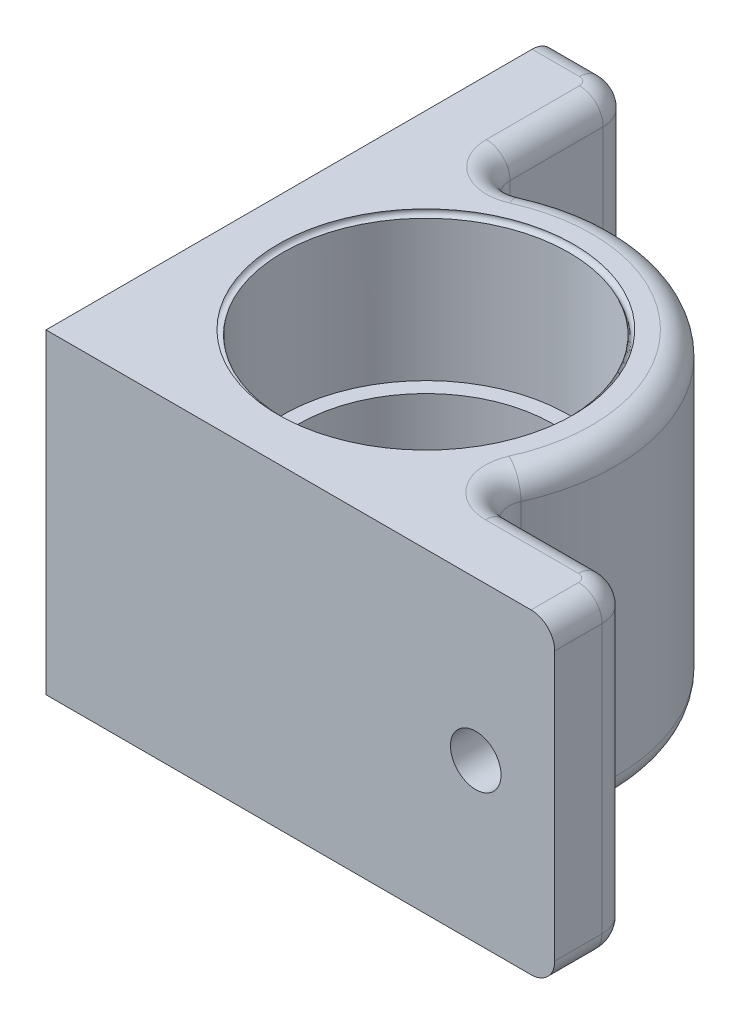
ISO-10303-21;
HEADER;
FILE_DESCRIPTION(('STEP AP214'),'2;1');
FILE_NAME('part.step','',(''),(''),'','','');
FILE_SCHEMA(('AUTOMOTIVE_DESIGN { 1 0 10303 214 1 1 1 1 }'));
ENDSEC;
DATA;
#1=APPLICATION_CONTEXT('core data for automotive mechanical design processes');
#2=APPLICATION_PROTOCOL_DEFINITION('international standard','automotive_design',2000,#1);
#3=PRODUCT_CONTEXT('',#1,'mechanical');
#4=PRODUCT('Part','Part','',(#3));
#5=PRODUCT_RELATED_PRODUCT_CATEGORY('part','',(#4));
#6=PRODUCT_DEFINITION_FORMATION('','',#4);
#7=PRODUCT_DEFINITION_CONTEXT('part definition',#1,'design');
#8=PRODUCT_DEFINITION('design','',#6,#7);
#9=PRODUCT_DEFINITION_SHAPE('','',#8);
#10=(LENGTH_UNIT() NAMED_UNIT(*) SI_UNIT(.MILLI.,.METRE.));
#11=(NAMED_UNIT(*) PLANE_ANGLE_UNIT() SI_UNIT($,.RADIAN.));
#12=(NAMED_UNIT(*) SI_UNIT($,.STERADIAN.) SOLID_ANGLE_UNIT());
#13=UNCERTAINTY_MEASURE_WITH_UNIT(LENGTH_MEASURE(1.E-05),#10,'distance_accuracy_value','');
#14=(GEOMETRIC_REPRESENTATION_CONTEXT(3) GLOBAL_UNCERTAINTY_ASSIGNED_CONTEXT((#13)) GLOBAL_UNIT_ASSIGNED_CONTEXT((#10,
#11,#12)) REPRESENTATION_CONTEXT('',''));
#15=CARTESIAN_POINT('',(0.,0.,0.));
#16=DIRECTION('',(0.,0.,1.));
#17=DIRECTION('',(1.,0.,0.));
#18=AXIS2_PLACEMENT_3D('',#15,#16,#17);
#19=CARTESIAN_POINT('',(60.9964175795956,-171.32327442611,171.000000000005));
#20=DIRECTION('',(0.,-1.,0.));
#21=DIRECTION('',(0.,0.,-1.));
#22=AXIS2_PLACEMENT_3D('',#19,#20,#21);
#23=CYLINDRICAL_SURFACE('',#22,8.05000000000001);
#24=CARTESIAN_POINT('',(60.9964175795957,-175.17327442611,171.000000000005));
#25=DIRECTION('',(0.,-1.,0.));
#26=DIRECTION('',(0.,0.,-1.));
#27=AXIS2_PLACEMENT_3D('',#24,#25,#26);
#28=CIRCLE('',#27,8.05000000000001);
#29=CARTESIAN_POINT('',(60.9964175795957,-175.17327442611,162.950000000005));
#30=VERTEX_POINT('',#29);
#31=EDGE_CURVE('E492',#30,#30,#28,.T.);
#32=ORIENTED_EDGE('',*,*,#31,.T.);
#33=EDGE_LOOP('',(#32));
#34=FACE_BOUND('',#33,.T.);
#35=CARTESIAN_POINT('',(60.9964175795956,-171.37327442611,171.000000000005));
#36=DIRECTION('',(0.,-1.,0.));
#37=DIRECTION('',(1.,0.,0.));
#38=AXIS2_PLACEMENT_3D('',#35,#36,#37);
#39=CIRCLE('',#38,8.05000000000001);
#40=CARTESIAN_POINT('',(69.0464175795956,-171.37327442611,171.000000000005));
#41=VERTEX_POINT('',#40);
#42=EDGE_CURVE('E493',#41,#41,#39,.T.);
#43=ORIENTED_EDGE('',*,*,#42,.F.);
#44=EDGE_LOOP('',(#43));
#45=FACE_BOUND('',#44,.T.);
#46=ADVANCED_FACE('F53',(#34,#45),#23,.F.);
#47=CARTESIAN_POINT('',(79.69443797963,-163.673274426109,173.540000042647));
#48=DIRECTION('',(0.,0.,-1.));
#49=DIRECTION('',(0.,-1.,0.));
#50=AXIS2_PLACEMENT_3D('',#47,#48,#49);
#51=CYLINDRICAL_SURFACE('',#50,1.5);
#52=DIRECTION('',(0.,0.,-1.));
#53=VECTOR('',#52,1.);
#54=CARTESIAN_POINT('',(81.19443797963,-163.673274426109,173.540000042647));
#55=LINE('',#54,#53);
#56=CARTESIAN_POINT('',(81.19443797963,-163.673274426109,183.040000042647));
#57=VERTEX_POINT('',#56);
#58=CARTESIAN_POINT('',(81.19443797963,-163.673274426109,180.040000042647));
#59=VERTEX_POINT('',#58);
#60=EDGE_CURVE('E75',#57,#59,#55,.T.);
#61=ORIENTED_EDGE('',*,*,#60,.T.);
#62=CARTESIAN_POINT('',(79.69443797963,-163.673274426109,180.040000042647));
#63=DIRECTION('',(0.,0.,1.));
#64=DIRECTION('',(1.,0.,0.));
#65=AXIS2_PLACEMENT_3D('',#62,#63,#64);
#66=CIRCLE('',#65,1.5);
#67=CARTESIAN_POINT('',(79.6944379796299,-162.173274426109,180.040000042647));
#68=VERTEX_POINT('',#67);
#69=EDGE_CURVE('E500',#59,#68,#66,.T.);
#70=ORIENTED_EDGE('',*,*,#69,.T.);
#71=DIRECTION('',(0.,0.,1.));
#72=VECTOR('',#71,1.);
#73=CARTESIAN_POINT('',(79.6944379796299,-162.173274426109,173.540000042647));
#74=LINE('',#73,#72);
#75=CARTESIAN_POINT('',(79.6944379796299,-162.173274426109,183.040000042647));
#76=VERTEX_POINT('',#75);
#77=EDGE_CURVE('E501',#68,#76,#74,.T.);
#78=ORIENTED_EDGE('',*,*,#77,.T.);
#79=CARTESIAN_POINT('',(79.69443797963,-163.673274426109,183.040000042647));
#80=DIRECTION('',(0.,0.,-1.));
#81=DIRECTION('',(0.,-1.,0.));
#82=AXIS2_PLACEMENT_3D('',#79,#80,#81);
#83=CIRCLE('',#82,1.5);
#84=EDGE_CURVE('E488',#76,#57,#83,.T.);
#85=ORIENTED_EDGE('',*,*,#84,.T.);
#86=EDGE_LOOP('',(#61,#70,#78,#85));
#87=FACE_BOUND('',#86,.T.);
#88=ADVANCED_FACE('F710',(#87),#51,.T.);
#89=CARTESIAN_POINT('',(79.19443797963,-163.673274426109,180.040000042647));
#90=DIRECTION('',(0.,-1.,0.));
#91=DIRECTION('',(0.,0.,-1.));
#92=AXIS2_PLACEMENT_3D('',#89,#90,#91);
#93=DEGENERATE_TOROIDAL_SURFACE('',#92,0.5,1.5,.T.);
#94=CARTESIAN_POINT('',(79.19443797963,-163.673274426109,179.540000042648));
#95=DIRECTION('',(1.,0.,0.));
#96=DIRECTION('',(0.,1.,0.));
#97=AXIS2_PLACEMENT_3D('',#94,#95,#96);
#98=CIRCLE('',#97,1.50000000000002);
#99=CARTESIAN_POINT('',(79.19443797963,-163.673274426109,178.040000042647));
#100=VERTEX_POINT('',#99);
#101=CARTESIAN_POINT('',(79.19443797963,-162.173274426109,179.540000042648));
#102=VERTEX_POINT('',#101);
#103=EDGE_CURVE('E504',#100,#102,#98,.T.);
#104=ORIENTED_EDGE('',*,*,#103,.T.);
#105=CARTESIAN_POINT('',(79.19443797963,-162.173274426109,180.040000042647));
#106=DIRECTION('',(0.,-1.,0.));
#107=DIRECTION('',(0.,0.,-1.));
#108=AXIS2_PLACEMENT_3D('',#105,#106,#107);
#109=CIRCLE('',#108,0.5);
#110=EDGE_CURVE('E507',#102,#68,#109,.T.);
#111=ORIENTED_EDGE('',*,*,#110,.T.);
#112=ORIENTED_EDGE('',*,*,#69,.F.);
#113=CARTESIAN_POINT('',(79.19443797963,-163.673274426109,180.040000042647));
#114=DIRECTION('',(0.,1.,0.));
#115=DIRECTION('',(1.,0.,0.));
#116=AXIS2_PLACEMENT_3D('',#113,#114,#115);
#117=CIRCLE('',#116,2.);
#118=EDGE_CURVE('E511',#59,#100,#117,.T.);
#119=ORIENTED_EDGE('',*,*,#118,.T.);
#120=EDGE_LOOP('',(#104,#111,#112,#119));
#121=FACE_BOUND('',#120,.T.);
#122=ADVANCED_FACE('F718',(#121),#93,.T.);
#123=CARTESIAN_POINT('',(66.9505892490733,-163.67327442611,179.540000042647));
#124=DIRECTION('',(-1.,0.,0.));
#125=DIRECTION('',(0.,1.,0.));
#126=AXIS2_PLACEMENT_3D('',#123,#124,#125);
#127=CYLINDRICAL_SURFACE('',#126,1.5);
#128=CARTESIAN_POINT('',(73.3073232947539,-163.673274426109,179.540000042647));
#129=DIRECTION('',(1.,0.,0.));
#130=DIRECTION('',(0.,1.,0.));
#131=AXIS2_PLACEMENT_3D('',#128,#129,#130);
#132=CIRCLE('',#131,1.49999999999999);
#133=CARTESIAN_POINT('',(73.3073232947539,-163.673274426109,178.040000042647));
#134=VERTEX_POINT('',#133);
#135=CARTESIAN_POINT('',(73.3073232947538,-162.173274426109,179.540000042647));
#136=VERTEX_POINT('',#135);
#137=EDGE_CURVE('E520',#134,#136,#132,.T.);
#138=ORIENTED_EDGE('',*,*,#137,.T.);
#139=DIRECTION('',(1.,0.,0.));
#140=VECTOR('',#139,1.);
#141=CARTESIAN_POINT('',(66.9505892490732,-162.17327442611,179.540000042647));
#142=LINE('',#141,#140);
#143=EDGE_CURVE('E523',#136,#102,#142,.T.);
#144=ORIENTED_EDGE('',*,*,#143,.T.);
#145=ORIENTED_EDGE('',*,*,#103,.F.);
#146=DIRECTION('',(-1.,0.,0.));
#147=VECTOR('',#146,1.);
#148=CARTESIAN_POINT('',(66.9505892490733,-163.67327442611,178.040000042647));
#149=LINE('',#148,#147);
#150=EDGE_CURVE('E524',#100,#134,#149,.T.);
#151=ORIENTED_EDGE('',*,*,#150,.T.);
#152=EDGE_LOOP('',(#138,#144,#145,#151));
#153=FACE_BOUND('',#152,.T.);
#154=ADVANCED_FACE('F731',(#153),#127,.T.);
#155=CARTESIAN_POINT('',(73.3073232947539,-163.673274426109,176.540000042648));
#156=DIRECTION('',(0.,1.,0.));
#157=DIRECTION('',(1.,0.,0.));
#158=AXIS2_PLACEMENT_3D('',#155,#156,#157);
#159=TOROIDAL_SURFACE('',#158,3.,1.5);
#160=CARTESIAN_POINT('',(70.5715664691631,-163.67327442611,175.30888892206));
#161=DIRECTION('',(-0.410370373529061,0.,0.911918941863595));
#162=DIRECTION('',(0.,1.,0.));
#163=AXIS2_PLACEMENT_3D('',#160,#161,#162);
#164=CIRCLE('',#163,1.49999999999997);
#165=CARTESIAN_POINT('',(71.9394448819585,-163.67327442611,175.924444482354));
#166=VERTEX_POINT('',#165);
#167=CARTESIAN_POINT('',(70.571566469163,-162.17327442611,175.30888892206));
#168=VERTEX_POINT('',#167);
#169=EDGE_CURVE('E530',#166,#168,#164,.T.);
#170=ORIENTED_EDGE('',*,*,#169,.T.);
#171=CARTESIAN_POINT('',(73.3073232947538,-162.173274426109,176.540000042648));
#172=DIRECTION('',(0.,1.,0.));
#173=DIRECTION('',(1.,0.,0.));
#174=AXIS2_PLACEMENT_3D('',#171,#172,#173);
#175=CIRCLE('',#174,3.);
#176=EDGE_CURVE('E531',#168,#136,#175,.T.);
#177=ORIENTED_EDGE('',*,*,#176,.T.);
#178=ORIENTED_EDGE('',*,*,#137,.F.);
#179=CARTESIAN_POINT('',(73.3073232947539,-163.673274426109,176.540000042648));
#180=DIRECTION('',(0.,-1.,0.));
#181=DIRECTION('',(0.,0.,-1.));
#182=AXIS2_PLACEMENT_3D('',#179,#180,#181);
#183=CIRCLE('',#182,1.5);
#184=EDGE_CURVE('E540',#134,#166,#183,.T.);
#185=ORIENTED_EDGE('',*,*,#184,.T.);
#186=EDGE_LOOP('',(#170,#177,#178,#185));
#187=FACE_BOUND('',#186,.T.);
#188=ADVANCED_FACE('F748',(#187),#159,.T.);
#189=CARTESIAN_POINT('',(60.9964175795953,-163.67327442611,171.000000000005));
#190=DIRECTION('',(0.,1.,0.));
#191=DIRECTION('',(1.,0.,0.));
#192=AXIS2_PLACEMENT_3D('',#189,#190,#191);
#193=TOROIDAL_SURFACE('',#192,10.5,1.5);
#194=CARTESIAN_POINT('',(56.7186556685112,-163.67327442611,161.410904472685));
#195=DIRECTION('',(0.91324719307814,0.,-0.407405896293732));
#196=DIRECTION('',(0.,-1.,0.));
#197=AXIS2_PLACEMENT_3D('',#194,#195,#196);
#198=CIRCLE('',#197,1.49999999999999);
#199=CARTESIAN_POINT('',(56.1075468240706,-163.67327442611,160.041033683067));
#200=VERTEX_POINT('',#199);
#201=CARTESIAN_POINT('',(56.7186556685111,-162.17327442611,161.410904472685));
#202=VERTEX_POINT('',#201);
#203=EDGE_CURVE('E541',#200,#202,#198,.T.);
#204=ORIENTED_EDGE('',*,*,#203,.T.);
#205=CARTESIAN_POINT('',(60.9964175795953,-162.17327442611,171.000000000005));
#206=DIRECTION('',(0.,-1.,0.));
#207=DIRECTION('',(0.,0.,-1.));
#208=AXIS2_PLACEMENT_3D('',#205,#206,#207);
#209=CIRCLE('',#208,10.5);
#210=EDGE_CURVE('E544',#202,#168,#209,.T.);
#211=ORIENTED_EDGE('',*,*,#210,.T.);
#212=ORIENTED_EDGE('',*,*,#169,.F.);
#213=CARTESIAN_POINT('',(60.9964175795953,-163.67327442611,171.000000000005));
#214=DIRECTION('',(0.,1.,0.));
#215=DIRECTION('',(1.,0.,0.));
#216=AXIS2_PLACEMENT_3D('',#213,#214,#215);
#217=CIRCLE('',#216,12.);
#218=EDGE_CURVE('E548',#166,#200,#217,.T.);
#219=ORIENTED_EDGE('',*,*,#218,.T.);
#220=EDGE_LOOP('',(#204,#211,#212,#219));
#221=FACE_BOUND('',#220,.T.);
#222=ADVANCED_FACE('F758',(#221),#193,.T.);
#223=CARTESIAN_POINT('',(55.49643797963,-163.67327442611,158.67116289345));
#224=DIRECTION('',(0.,1.,0.));
#225=DIRECTION('',(1.,0.,0.));
#226=AXIS2_PLACEMENT_3D('',#223,#224,#225);
#227=TOROIDAL_SURFACE('',#226,3.,1.5);
#228=CARTESIAN_POINT('',(52.49643797963,-163.67327442611,158.67116289345));
#229=DIRECTION('',(0.,0.,1.));
#230=DIRECTION('',(1.,0.,0.));
#231=AXIS2_PLACEMENT_3D('',#228,#229,#230);
#232=CIRCLE('',#231,1.49999999999999);
#233=CARTESIAN_POINT('',(53.99643797963,-163.67327442611,158.67116289345));
#234=VERTEX_POINT('',#233);
#235=CARTESIAN_POINT('',(52.4964379796299,-162.17327442611,158.67116289345));
#236=VERTEX_POINT('',#235);
#237=EDGE_CURVE('E554',#234,#236,#232,.T.);
#238=ORIENTED_EDGE('',*,*,#237,.T.);
#239=CARTESIAN_POINT('',(55.4964379796299,-162.17327442611,158.67116289345));
#240=DIRECTION('',(0.,1.,0.));
#241=DIRECTION('',(1.,0.,0.));
#242=AXIS2_PLACEMENT_3D('',#239,#240,#241);
#243=CIRCLE('',#242,3.);
#244=EDGE_CURVE('E560',#236,#202,#243,.T.);
#245=ORIENTED_EDGE('',*,*,#244,.T.);
#246=ORIENTED_EDGE('',*,*,#203,.F.);
#247=CARTESIAN_POINT('',(55.49643797963,-163.67327442611,158.67116289345));
#248=DIRECTION('',(0.,-1.,0.));
#249=DIRECTION('',(0.,0.,-1.));
#250=AXIS2_PLACEMENT_3D('',#247,#248,#249);
#251=CIRCLE('',#250,1.5);
#252=EDGE_CURVE('E563',#200,#234,#251,.T.);
#253=ORIENTED_EDGE('',*,*,#252,.T.);
#254=EDGE_LOOP('',(#238,#245,#246,#253));
#255=FACE_BOUND('',#254,.T.);
#256=ADVANCED_FACE('F769',(#255),#227,.T.);
#257=CARTESIAN_POINT('',(52.49643797963,-163.67327442611,161.697927492911));
#258=DIRECTION('',(0.,0.,-1.));
#259=DIRECTION('',(0.,-1.,0.));
#260=AXIS2_PLACEMENT_3D('',#257,#258,#259);
#261=CYLINDRICAL_SURFACE('',#260,1.5);
#262=CARTESIAN_POINT('',(52.49643797963,-163.67327442611,152.775000042647));
#263=DIRECTION('',(0.,0.,1.));
#264=DIRECTION('',(1.,0.,0.));
#265=AXIS2_PLACEMENT_3D('',#262,#263,#264);
#266=CIRCLE('',#265,1.5);
#267=CARTESIAN_POINT('',(53.99643797963,-163.67327442611,152.775000042647));
#268=VERTEX_POINT('',#267);
#269=CARTESIAN_POINT('',(52.4964379796299,-162.17327442611,152.775000042647));
#270=VERTEX_POINT('',#269);
#271=EDGE_CURVE('E562',#268,#270,#266,.T.);
#272=ORIENTED_EDGE('',*,*,#271,.T.);
#273=DIRECTION('',(0.,0.,1.));
#274=VECTOR('',#273,1.);
#275=CARTESIAN_POINT('',(52.4964379796299,-162.17327442611,161.697927492911));
#276=LINE('',#275,#274);
#277=EDGE_CURVE('E566',#270,#236,#276,.T.);
#278=ORIENTED_EDGE('',*,*,#277,.T.);
#279=ORIENTED_EDGE('',*,*,#237,.F.);
#280=DIRECTION('',(0.,0.,-1.));
#281=VECTOR('',#280,1.);
#282=CARTESIAN_POINT('',(53.99643797963,-163.67327442611,161.697927492911));
#283=LINE('',#282,#281);
#284=EDGE_CURVE('E434',#234,#268,#283,.T.);
#285=ORIENTED_EDGE('',*,*,#284,.T.);
#286=EDGE_LOOP('',(#272,#278,#279,#285));
#287=FACE_BOUND('',#286,.T.);
#288=ADVANCED_FACE('F785',(#287),#261,.T.);
#289=CARTESIAN_POINT('',(51.99643797963,-163.67327442611,152.775000042647));
#290=DIRECTION('',(0.,-1.,0.));
#291=DIRECTION('',(0.,0.,-1.));
#292=AXIS2_PLACEMENT_3D('',#289,#290,#291);
#293=DEGENERATE_TOROIDAL_SURFACE('',#292,0.5,1.5,.T.);
#294=CARTESIAN_POINT('',(51.99643797963,-163.67327442611,152.275000042647));
#295=DIRECTION('',(1.,0.,0.));
#296=DIRECTION('',(0.,1.,0.));
#297=AXIS2_PLACEMENT_3D('',#294,#295,#296);
#298=CIRCLE('',#297,1.49999999999999);
#299=CARTESIAN_POINT('',(51.99643797963,-163.67327442611,150.775000042647));
#300=VERTEX_POINT('',#299);
#301=CARTESIAN_POINT('',(51.9964379796299,-162.17327442611,152.275000042647));
#302=VERTEX_POINT('',#301);
#303=EDGE_CURVE('E573',#300,#302,#298,.T.);
#304=ORIENTED_EDGE('',*,*,#303,.T.);
#305=CARTESIAN_POINT('',(51.9964379796299,-162.17327442611,152.775000042647));
#306=DIRECTION('',(0.,-1.,0.));
#307=DIRECTION('',(0.,0.,-1.));
#308=AXIS2_PLACEMENT_3D('',#305,#306,#307);
#309=CIRCLE('',#308,0.5);
#310=EDGE_CURVE('E580',#302,#270,#309,.T.);
#311=ORIENTED_EDGE('',*,*,#310,.T.);
#312=ORIENTED_EDGE('',*,*,#271,.F.);
#313=CARTESIAN_POINT('',(51.99643797963,-163.67327442611,152.775000042647));
#314=DIRECTION('',(0.,1.,0.));
#315=DIRECTION('',(1.,0.,0.));
#316=AXIS2_PLACEMENT_3D('',#313,#314,#315);
#317=CIRCLE('',#316,2.);
#318=EDGE_CURVE('E467',#268,#300,#317,.T.);
#319=ORIENTED_EDGE('',*,*,#318,.T.);
#320=EDGE_LOOP('',(#304,#311,#312,#319));
#321=FACE_BOUND('',#320,.T.);
#322=ADVANCED_FACE('F589',(#321),#293,.T.);
#323=CARTESIAN_POINT('',(56.4964328796213,-163.67327442611,152.275000042647));
#324=DIRECTION('',(-1.,0.,0.));
#325=DIRECTION('',(0.,1.,0.));
#326=AXIS2_PLACEMENT_3D('',#323,#324,#325);
#327=CYLINDRICAL_SURFACE('',#326,1.5);
#328=CARTESIAN_POINT('',(48.99643797963,-163.67327442611,152.275000042647));
#329=DIRECTION('',(1.,0.,0.));
#330=DIRECTION('',(0.,1.,0.));
#331=AXIS2_PLACEMENT_3D('',#328,#329,#330);
#332=CIRCLE('',#331,1.5);
#333=CARTESIAN_POINT('',(48.99643797963,-163.67327442611,150.775000042647));
#334=VERTEX_POINT('',#333);
#335=CARTESIAN_POINT('',(48.9964379796299,-162.17327442611,152.275000042647));
#336=VERTEX_POINT('',#335);
#337=EDGE_CURVE('E463',#334,#336,#332,.T.);
#338=ORIENTED_EDGE('',*,*,#337,.T.);
#339=DIRECTION('',(1.,0.,0.));
#340=VECTOR('',#339,1.);
#341=CARTESIAN_POINT('',(56.4964328796213,-162.17327442611,152.275000042647));
#342=LINE('',#341,#340);
#343=EDGE_CURVE('E458',#336,#302,#342,.T.);
#344=ORIENTED_EDGE('',*,*,#343,.T.);
#345=ORIENTED_EDGE('',*,*,#303,.F.);
#346=DIRECTION('',(-1.,0.,0.));
#347=VECTOR('',#346,1.);
#348=CARTESIAN_POINT('',(56.4964328796213,-163.67327442611,150.775000042647));
#349=LINE('',#348,#347);
#350=EDGE_CURVE('E455',#300,#334,#349,.T.);
#351=ORIENTED_EDGE('',*,*,#350,.T.);
#352=EDGE_LOOP('',(#338,#344,#345,#351));
#353=FACE_BOUND('',#352,.T.);
#354=ADVANCED_FACE('F595',(#353),#327,.T.);
#355=CARTESIAN_POINT('',(48.9964379796303,-174.17327442611,150.775000042648));
#356=DIRECTION('',(0.,0.,-1.));
#357=DIRECTION('',(0.,1.,0.));
#358=AXIS2_PLACEMENT_3D('',#355,#356,#357);
#359=PLANE('',#358);
#360=ORIENTED_EDGE('',*,*,#350,.F.);
#361=DIRECTION('',(0.,1.,0.));
#362=VECTOR('',#361,1.);
#363=CARTESIAN_POINT('',(51.9964379796303,-173.17327442611,150.775000042648));
#364=LINE('',#363,#362);
#365=CARTESIAN_POINT('',(51.9964379796306,-180.67327442611,150.775000042648));
#366=VERTEX_POINT('',#365);
#367=EDGE_CURVE('E445',#366,#300,#364,.T.);
#368=ORIENTED_EDGE('',*,*,#367,.F.);
#369=DIRECTION('',(1.,0.,0.));
#370=VECTOR('',#369,1.);
#371=CARTESIAN_POINT('',(56.4964328796219,-180.67327442611,150.775000042648));
#372=LINE('',#371,#370);
#373=CARTESIAN_POINT('',(48.9964379796306,-180.67327442611,150.775000042648));
#374=VERTEX_POINT('',#373);
#375=EDGE_CURVE('E208',#374,#366,#372,.T.);
#376=ORIENTED_EDGE('',*,*,#375,.F.);
#377=DIRECTION('',(0.,1.,0.));
#378=VECTOR('',#377,1.);
#379=CARTESIAN_POINT('',(48.9964379796303,-174.17327442611,150.775000042647));
#380=LINE('',#379,#378);
#381=EDGE_CURVE('E218',#374,#334,#380,.T.);
#382=ORIENTED_EDGE('',*,*,#381,.T.);
#383=EDGE_LOOP('',(#360,#368,#376,#382));
#384=FACE_BOUND('',#383,.T.);
#385=ADVANCED_FACE('F598',(#384),#359,.T.);
#386=CARTESIAN_POINT('',(51.9964379796303,-173.17327442611,152.775000042648));
#387=DIRECTION('',(0.,1.,0.));
#388=DIRECTION('',(1.,0.,0.));
#389=AXIS2_PLACEMENT_3D('',#386,#387,#388);
#390=CYLINDRICAL_SURFACE('',#389,2.);
#391=ORIENTED_EDGE('',*,*,#318,.F.);
#392=DIRECTION('',(0.,-1.,0.));
#393=VECTOR('',#392,1.);
#394=CARTESIAN_POINT('',(53.9964379796303,-173.17327442611,152.775000042648));
#395=LINE('',#394,#393);
#396=CARTESIAN_POINT('',(53.9964379796306,-180.67327442611,152.775000042648));
#397=VERTEX_POINT('',#396);
#398=EDGE_CURVE('E450',#268,#397,#395,.T.);
#399=ORIENTED_EDGE('',*,*,#398,.T.);
#400=CARTESIAN_POINT('',(51.9964379796306,-180.67327442611,152.775000042648));
#401=DIRECTION('',(0.,-1.,0.));
#402=DIRECTION('',(0.,0.,-1.));
#403=AXIS2_PLACEMENT_3D('',#400,#401,#402);
#404=CIRCLE('',#403,2.);
#405=EDGE_CURVE('E264',#366,#397,#404,.T.);
#406=ORIENTED_EDGE('',*,*,#405,.F.);
#407=ORIENTED_EDGE('',*,*,#367,.T.);
#408=EDGE_LOOP('',(#391,#399,#406,#407));
#409=FACE_BOUND('',#408,.T.);
#410=ADVANCED_FACE('F596',(#409),#390,.T.);
#411=CARTESIAN_POINT('',(53.9964379796303,-172.17327442611,155.355854943175));
#412=DIRECTION('',(1.,0.,0.));
#413=DIRECTION('',(0.,1.,0.));
#414=AXIS2_PLACEMENT_3D('',#411,#412,#413);
#415=PLANE('',#414);
#416=CARTESIAN_POINT('',(53.9964379796303,-172.17327442611,155.775014209364));
#417=DIRECTION('',(1.,0.,0.));
#418=DIRECTION('',(0.,1.,0.));
#419=AXIS2_PLACEMENT_3D('',#416,#417,#418);
#420=CIRCLE('',#419,1.6);
#421=CARTESIAN_POINT('',(53.9964379796302,-170.57327442611,155.775014209364));
#422=VERTEX_POINT('',#421);
#423=EDGE_CURVE('E228',#422,#422,#420,.T.);
#424=ORIENTED_EDGE('',*,*,#423,.F.);
#425=EDGE_LOOP('',(#424));
#426=FACE_BOUND('',#425,.T.);
#427=ORIENTED_EDGE('',*,*,#284,.F.);
#428=DIRECTION('',(0.,1.,0.));
#429=VECTOR('',#428,1.);
#430=CARTESIAN_POINT('',(53.9964379796303,-174.17327442611,158.67116289345));
#431=LINE('',#430,#429);
#432=CARTESIAN_POINT('',(53.9964379796306,-180.67327442611,158.67116289345));
#433=VERTEX_POINT('',#432);
#434=EDGE_CURVE('E334',#433,#234,#431,.T.);
#435=ORIENTED_EDGE('',*,*,#434,.F.);
#436=DIRECTION('',(0.,0.,1.));
#437=VECTOR('',#436,1.);
#438=CARTESIAN_POINT('',(53.9964379796306,-180.67327442611,161.697927492911));
#439=LINE('',#438,#437);
#440=EDGE_CURVE('E416',#397,#433,#439,.T.);
#441=ORIENTED_EDGE('',*,*,#440,.F.);
#442=ORIENTED_EDGE('',*,*,#398,.F.);
#443=EDGE_LOOP('',(#427,#435,#441,#442));
#444=FACE_BOUND('',#443,.T.);
#445=ADVANCED_FACE('F433',(#426,#444),#415,.T.);
#446=CARTESIAN_POINT('',(55.4964379796304,-174.17327442611,158.67116289345));
#447=DIRECTION('',(0.,1.,0.));
#448=DIRECTION('',(1.,0.,0.));
#449=AXIS2_PLACEMENT_3D('',#446,#447,#448);
#450=CYLINDRICAL_SURFACE('',#449,1.5);
#451=ORIENTED_EDGE('',*,*,#252,.F.);
#452=DIRECTION('',(0.,-1.,0.));
#453=VECTOR('',#452,1.);
#454=CARTESIAN_POINT('',(56.1075468240709,-174.17327442611,160.041033683067));
#455=LINE('',#454,#453);
#456=CARTESIAN_POINT('',(56.1075468240712,-180.67327442611,160.041033683068));
#457=VERTEX_POINT('',#456);
#458=EDGE_CURVE('E431',#200,#457,#455,.T.);
#459=ORIENTED_EDGE('',*,*,#458,.T.);
#460=CARTESIAN_POINT('',(55.4964379796306,-180.67327442611,158.67116289345));
#461=DIRECTION('',(0.,1.,0.));
#462=DIRECTION('',(1.,0.,0.));
#463=AXIS2_PLACEMENT_3D('',#460,#461,#462);
#464=CIRCLE('',#463,1.5);
#465=EDGE_CURVE('E286',#433,#457,#464,.T.);
#466=ORIENTED_EDGE('',*,*,#465,.F.);
#467=ORIENTED_EDGE('',*,*,#434,.T.);
#468=EDGE_LOOP('',(#451,#459,#466,#467));
#469=FACE_BOUND('',#468,.T.);
#470=ADVANCED_FACE('F427',(#469),#450,.F.);
#471=CARTESIAN_POINT('',(60.9964175795957,-174.17327442611,171.000000000005));
#472=DIRECTION('',(0.,-1.,0.));
#473=DIRECTION('',(0.,0.,-1.));
#474=AXIS2_PLACEMENT_3D('',#471,#472,#473);
#475=CYLINDRICAL_SURFACE('',#474,12.);
#476=ORIENTED_EDGE('',*,*,#218,.F.);
#477=DIRECTION('',(0.,1.,0.));
#478=VECTOR('',#477,1.);
#479=CARTESIAN_POINT('',(71.9394448819588,-174.173274426109,175.924444482354));
#480=LINE('',#479,#478);
#481=CARTESIAN_POINT('',(71.939444881959,-180.67327442611,175.924444482354));
#482=VERTEX_POINT('',#481);
#483=EDGE_CURVE('E330',#482,#166,#480,.T.);
#484=ORIENTED_EDGE('',*,*,#483,.F.);
#485=CARTESIAN_POINT('',(60.9964175795959,-180.67327442611,171.000000000005));
#486=DIRECTION('',(0.,-1.,0.));
#487=DIRECTION('',(0.,0.,-1.));
#488=AXIS2_PLACEMENT_3D('',#485,#486,#487);
#489=CIRCLE('',#488,12.);
#490=EDGE_CURVE('E315',#457,#482,#489,.T.);
#491=ORIENTED_EDGE('',*,*,#490,.F.);
#492=ORIENTED_EDGE('',*,*,#458,.F.);
#493=EDGE_LOOP('',(#476,#484,#491,#492));
#494=FACE_BOUND('',#493,.T.);
#495=ADVANCED_FACE('F858',(#494),#475,.T.);
#496=CARTESIAN_POINT('',(73.3073232947542,-174.173274426109,176.540000042648));
#497=DIRECTION('',(0.,1.,0.));
#498=DIRECTION('',(1.,0.,0.));
#499=AXIS2_PLACEMENT_3D('',#496,#497,#498);
#500=CYLINDRICAL_SURFACE('',#499,1.5);
#501=ORIENTED_EDGE('',*,*,#184,.F.);
#502=DIRECTION('',(0.,-1.,0.));
#503=VECTOR('',#502,1.);
#504=CARTESIAN_POINT('',(73.3073232947542,-174.173274426109,178.040000042648));
#505=LINE('',#504,#503);
#506=CARTESIAN_POINT('',(73.3073232947544,-180.673274426109,178.040000042648));
#507=VERTEX_POINT('',#506);
#508=EDGE_CURVE('E328',#134,#507,#505,.T.);
#509=ORIENTED_EDGE('',*,*,#508,.T.);
#510=CARTESIAN_POINT('',(73.3073232947544,-180.673274426109,176.540000042648));
#511=DIRECTION('',(0.,1.,0.));
#512=DIRECTION('',(1.,0.,0.));
#513=AXIS2_PLACEMENT_3D('',#510,#511,#512);
#514=CIRCLE('',#513,1.5);
#515=EDGE_CURVE('E304',#482,#507,#514,.T.);
#516=ORIENTED_EDGE('',*,*,#515,.F.);
#517=ORIENTED_EDGE('',*,*,#483,.T.);
#518=EDGE_LOOP('',(#501,#509,#516,#517));
#519=FACE_BOUND('',#518,.T.);
#520=ADVANCED_FACE('F870',(#519),#500,.F.);
#521=CARTESIAN_POINT('',(69.9047507185343,-174.17327442611,178.040000042648));
#522=DIRECTION('',(0.,0.,-1.));
#523=DIRECTION('',(0.,1.,0.));
#524=AXIS2_PLACEMENT_3D('',#521,#522,#523);
#525=PLANE('',#524);
#526=CARTESIAN_POINT('',(76.1945602540284,-172.173274426109,178.040000042648));
#527=DIRECTION('',(0.,0.,1.));
#528=DIRECTION('',(0.,-1.,0.));
#529=AXIS2_PLACEMENT_3D('',#526,#527,#528);
#530=CIRCLE('',#529,1.6);
#531=CARTESIAN_POINT('',(76.1945602540284,-173.773274426109,178.040000042648));
#532=VERTEX_POINT('',#531);
#533=EDGE_CURVE('E336',#532,#532,#530,.T.);
#534=ORIENTED_EDGE('',*,*,#533,.T.);
#535=EDGE_LOOP('',(#534));
#536=FACE_BOUND('',#535,.T.);
#537=ORIENTED_EDGE('',*,*,#150,.F.);
#538=DIRECTION('',(0.,1.,0.));
#539=VECTOR('',#538,1.);
#540=CARTESIAN_POINT('',(79.1944379796304,-174.173274426109,178.040000042648));
#541=LINE('',#540,#539);
#542=CARTESIAN_POINT('',(79.1944379796306,-180.673274426109,178.040000042648));
#543=VERTEX_POINT('',#542);
#544=EDGE_CURVE('E343',#543,#100,#541,.T.);
#545=ORIENTED_EDGE('',*,*,#544,.F.);
#546=DIRECTION('',(1.,0.,0.));
#547=VECTOR('',#546,1.);
#548=CARTESIAN_POINT('',(66.9505892490739,-180.67327442611,178.040000042648));
#549=LINE('',#548,#547);
#550=EDGE_CURVE('E347',#507,#543,#549,.T.);
#551=ORIENTED_EDGE('',*,*,#550,.F.);
#552=ORIENTED_EDGE('',*,*,#508,.F.);
#553=EDGE_LOOP('',(#537,#545,#551,#552));
#554=FACE_BOUND('',#553,.T.);
#555=ADVANCED_FACE('F879',(#536,#554),#525,.T.);
#556=CARTESIAN_POINT('',(79.1944379796304,-174.173274426109,180.040000042648));
#557=DIRECTION('',(0.,-1.,0.));
#558=DIRECTION('',(0.,0.,-1.));
#559=AXIS2_PLACEMENT_3D('',#556,#557,#558);
#560=CYLINDRICAL_SURFACE('',#559,2.);
#561=ORIENTED_EDGE('',*,*,#118,.F.);
#562=DIRECTION('',(0.,-1.,0.));
#563=VECTOR('',#562,1.);
#564=CARTESIAN_POINT('',(81.1944379796303,-174.173274426109,180.040000042648));
#565=LINE('',#564,#563);
#566=CARTESIAN_POINT('',(81.1944379796306,-180.673274426109,180.040000042648));
#567=VERTEX_POINT('',#566);
#568=EDGE_CURVE('E339',#59,#567,#565,.T.);
#569=ORIENTED_EDGE('',*,*,#568,.T.);
#570=CARTESIAN_POINT('',(79.1944379796306,-180.673274426109,180.040000042648));
#571=DIRECTION('',(0.,-1.,0.));
#572=DIRECTION('',(0.,0.,-1.));
#573=AXIS2_PLACEMENT_3D('',#570,#571,#572);
#574=CIRCLE('',#573,2.);
#575=EDGE_CURVE('E353',#543,#567,#574,.T.);
#576=ORIENTED_EDGE('',*,*,#575,.F.);
#577=ORIENTED_EDGE('',*,*,#544,.T.);
#578=EDGE_LOOP('',(#561,#569,#576,#577));
#579=FACE_BOUND('',#578,.T.);
#580=ADVANCED_FACE('F895',(#579),#560,.T.);
#581=CARTESIAN_POINT('',(81.1944379796303,-174.173274426109,179.040000042648));
#582=DIRECTION('',(1.,0.,0.));
#583=DIRECTION('',(0.,1.,0.));
#584=AXIS2_PLACEMENT_3D('',#581,#582,#583);
#585=PLANE('',#584);
#586=DIRECTION('',(0.,1.,0.));
#587=VECTOR('',#586,1.);
#588=CARTESIAN_POINT('',(81.1944379796303,-174.173274426109,183.040000042648));
#589=LINE('',#588,#587);
#590=CARTESIAN_POINT('',(81.1944379796306,-180.673274426109,183.040000042648));
#591=VERTEX_POINT('',#590);
#592=EDGE_CURVE('E357',#591,#57,#589,.T.);
#593=ORIENTED_EDGE('',*,*,#592,.F.);
#594=DIRECTION('',(0.,0.,1.));
#595=VECTOR('',#594,1.);
#596=CARTESIAN_POINT('',(81.1944379796306,-180.673274426109,173.540000042648));
#597=LINE('',#596,#595);
#598=EDGE_CURVE('E365',#567,#591,#597,.T.);
#599=ORIENTED_EDGE('',*,*,#598,.F.);
#600=ORIENTED_EDGE('',*,*,#568,.F.);
#601=ORIENTED_EDGE('',*,*,#60,.F.);
#602=EDGE_LOOP('',(#593,#599,#600,#601));
#603=FACE_BOUND('',#602,.T.);
#604=ADVANCED_FACE('F903',(#603),#585,.T.);
#605=CARTESIAN_POINT('',(78.9964379796303,-174.173274426109,183.040000042648));
#606=DIRECTION('',(0.,0.,1.));
#607=DIRECTION('',(0.,-1.,0.));
#608=AXIS2_PLACEMENT_3D('',#605,#606,#607);
#609=PLANE('',#608);
#610=ORIENTED_EDGE('',*,*,#84,.F.);
#611=DIRECTION('',(-1.,0.,0.));
#612=VECTOR('',#611,1.);
#613=CARTESIAN_POINT('',(71.4964328796213,-162.173274426109,183.040000042647));
#614=LINE('',#613,#612);
#615=CARTESIAN_POINT('',(48.9964379796299,-162.17327442611,183.040000042647));
#616=VERTEX_POINT('',#615);
#617=EDGE_CURVE('E344',#76,#616,#614,.T.);
#618=ORIENTED_EDGE('',*,*,#617,.T.);
#619=DIRECTION('',(0.,1.,0.));
#620=VECTOR('',#619,1.);
#621=CARTESIAN_POINT('',(48.9964379796303,-174.17327442611,183.040000042648));
#622=LINE('',#621,#620);
#623=CARTESIAN_POINT('',(48.9964379796306,-182.17327442611,183.040000042648));
#624=VERTEX_POINT('',#623);
#625=EDGE_CURVE('E229',#624,#616,#622,.T.);
#626=ORIENTED_EDGE('',*,*,#625,.F.);
#627=DIRECTION('',(1.,0.,0.));
#628=VECTOR('',#627,1.);
#629=CARTESIAN_POINT('',(71.496432879622,-182.173274426109,183.040000042648));
#630=LINE('',#629,#628);
#631=CARTESIAN_POINT('',(79.6944379796306,-182.173274426109,183.040000042648));
#632=VERTEX_POINT('',#631);
#633=EDGE_CURVE('E230',#624,#632,#630,.T.);
#634=ORIENTED_EDGE('',*,*,#633,.T.);
#635=CARTESIAN_POINT('',(79.6944379796306,-180.673274426109,183.040000042648));
#636=DIRECTION('',(0.,0.,-1.));
#637=DIRECTION('',(0.,-1.,0.));
#638=AXIS2_PLACEMENT_3D('',#635,#636,#637);
#639=CIRCLE('',#638,1.5);
#640=EDGE_CURVE('E373',#591,#632,#639,.T.);
#641=ORIENTED_EDGE('',*,*,#640,.F.);
#642=ORIENTED_EDGE('',*,*,#592,.T.);
#643=EDGE_LOOP('',(#610,#618,#626,#634,#641,#642));
#644=FACE_BOUND('',#643,.T.);
#645=CARTESIAN_POINT('',(76.1945602540284,-172.173274426109,183.040000042648));
#646=DIRECTION('',(0.,0.,-1.));
#647=DIRECTION('',(0.,-1.,0.));
#648=AXIS2_PLACEMENT_3D('',#645,#646,#647);
#649=CIRCLE('',#648,1.6);
#650=CARTESIAN_POINT('',(76.1945602540284,-173.773274426109,183.040000042648));
#651=VERTEX_POINT('',#650);
#652=EDGE_CURVE('E361',#651,#651,#649,.T.);
#653=ORIENTED_EDGE('',*,*,#652,.T.);
#654=EDGE_LOOP('',(#653));
#655=FACE_BOUND('',#654,.T.);
#656=ADVANCED_FACE('F920',(#644,#655),#609,.T.);
#657=CARTESIAN_POINT('',(79.6944379796306,-180.673274426109,173.540000042648));
#658=DIRECTION('',(0.,0.,-1.));
#659=DIRECTION('',(0.,-1.,0.));
#660=AXIS2_PLACEMENT_3D('',#657,#658,#659);
#661=CYLINDRICAL_SURFACE('',#660,1.5);
#662=DIRECTION('',(0.,0.,-1.));
#663=VECTOR('',#662,1.);
#664=CARTESIAN_POINT('',(79.6944379796306,-182.173274426109,173.540000042648));
#665=LINE('',#664,#663);
#666=CARTESIAN_POINT('',(79.6944379796306,-182.173274426109,180.040000042648));
#667=VERTEX_POINT('',#666);
#668=EDGE_CURVE('E376',#632,#667,#665,.T.);
#669=ORIENTED_EDGE('',*,*,#668,.T.);
#670=CARTESIAN_POINT('',(79.6944379796306,-180.673274426109,180.040000042648));
#671=DIRECTION('',(0.,0.,1.));
#672=DIRECTION('',(1.,0.,0.));
#673=AXIS2_PLACEMENT_3D('',#670,#671,#672);
#674=CIRCLE('',#673,1.49999999999999);
#675=EDGE_CURVE('E370',#667,#567,#674,.T.);
#676=ORIENTED_EDGE('',*,*,#675,.T.);
#677=ORIENTED_EDGE('',*,*,#598,.T.);
#678=ORIENTED_EDGE('',*,*,#640,.T.);
#679=EDGE_LOOP('',(#669,#676,#677,#678));
#680=FACE_BOUND('',#679,.T.);
#681=ADVANCED_FACE('F930',(#680),#661,.T.);
#682=CARTESIAN_POINT('',(79.1944379796306,-180.673274426109,180.040000042648));
#683=DIRECTION('',(0.,1.,0.));
#684=DIRECTION('',(1.,0.,0.));
#685=AXIS2_PLACEMENT_3D('',#682,#683,#684);
#686=DEGENERATE_TOROIDAL_SURFACE('',#685,0.5,1.5,.T.);
#687=CARTESIAN_POINT('',(79.1944379796306,-180.673274426109,179.540000042648));
#688=DIRECTION('',(1.,0.,0.));
#689=DIRECTION('',(0.,1.,0.));
#690=AXIS2_PLACEMENT_3D('',#687,#688,#689);
#691=CIRCLE('',#690,1.49999999999995);
#692=CARTESIAN_POINT('',(79.1944379796306,-182.173274426109,179.540000042648));
#693=VERTEX_POINT('',#692);
#694=EDGE_CURVE('E360',#693,#543,#691,.T.);
#695=ORIENTED_EDGE('',*,*,#694,.T.);
#696=ORIENTED_EDGE('',*,*,#575,.T.);
#697=ORIENTED_EDGE('',*,*,#675,.F.);
#698=CARTESIAN_POINT('',(79.1944379796306,-182.173274426109,180.040000042648));
#699=DIRECTION('',(0.,1.,0.));
#700=DIRECTION('',(1.,0.,0.));
#701=AXIS2_PLACEMENT_3D('',#698,#699,#700);
#702=CIRCLE('',#701,0.5);
#703=EDGE_CURVE('E356',#667,#693,#702,.T.);
#704=ORIENTED_EDGE('',*,*,#703,.T.);
#705=EDGE_LOOP('',(#695,#696,#697,#704));
#706=FACE_BOUND('',#705,.T.);
#707=ADVANCED_FACE('F936',(#706),#686,.T.);
#708=CARTESIAN_POINT('',(66.9505892490739,-180.67327442611,179.540000042648));
#709=DIRECTION('',(-1.,0.,0.));
#710=DIRECTION('',(0.,1.,0.));
#711=AXIS2_PLACEMENT_3D('',#708,#709,#710);
#712=CYLINDRICAL_SURFACE('',#711,1.5);
#713=CARTESIAN_POINT('',(73.3073232947544,-180.673274426109,179.540000042648));
#714=DIRECTION('',(1.,0.,0.));
#715=DIRECTION('',(0.,1.,0.));
#716=AXIS2_PLACEMENT_3D('',#713,#714,#715);
#717=CIRCLE('',#716,1.49999999999999);
#718=CARTESIAN_POINT('',(73.3073232947545,-182.173274426109,179.540000042648));
#719=VERTEX_POINT('',#718);
#720=EDGE_CURVE('E349',#719,#507,#717,.T.);
#721=ORIENTED_EDGE('',*,*,#720,.T.);
#722=ORIENTED_EDGE('',*,*,#550,.T.);
#723=ORIENTED_EDGE('',*,*,#694,.F.);
#724=DIRECTION('',(-1.,0.,0.));
#725=VECTOR('',#724,1.);
#726=CARTESIAN_POINT('',(66.9505892490739,-182.17327442611,179.540000042648));
#727=LINE('',#726,#725);
#728=EDGE_CURVE('E348',#693,#719,#727,.T.);
#729=ORIENTED_EDGE('',*,*,#728,.T.);
#730=EDGE_LOOP('',(#721,#722,#723,#729));
#731=FACE_BOUND('',#730,.T.);
#732=ADVANCED_FACE('F952',(#731),#712,.T.);
#733=CARTESIAN_POINT('',(73.3073232947544,-180.673274426109,176.540000042648));
#734=DIRECTION('',(0.,-1.,0.));
#735=DIRECTION('',(0.,0.,-1.));
#736=AXIS2_PLACEMENT_3D('',#733,#734,#735);
#737=TOROIDAL_SURFACE('',#736,3.,1.5);
#738=CARTESIAN_POINT('',(70.5715664691637,-180.67327442611,175.30888892206));
#739=DIRECTION('',(-0.410370373529061,0.,0.911918941863595));
#740=DIRECTION('',(0.,1.,0.));
#741=AXIS2_PLACEMENT_3D('',#738,#739,#740);
#742=CIRCLE('',#741,1.49999999999999);
#743=CARTESIAN_POINT('',(70.5715664691637,-182.17327442611,175.30888892206));
#744=VERTEX_POINT('',#743);
#745=EDGE_CURVE('E307',#744,#482,#742,.T.);
#746=ORIENTED_EDGE('',*,*,#745,.T.);
#747=ORIENTED_EDGE('',*,*,#515,.T.);
#748=ORIENTED_EDGE('',*,*,#720,.F.);
#749=CARTESIAN_POINT('',(73.3073232947545,-182.173274426109,176.540000042648));
#750=DIRECTION('',(0.,-1.,0.));
#751=DIRECTION('',(0.,0.,-1.));
#752=AXIS2_PLACEMENT_3D('',#749,#750,#751);
#753=CIRCLE('',#752,3.);
#754=EDGE_CURVE('E303',#719,#744,#753,.T.);
#755=ORIENTED_EDGE('',*,*,#754,.T.);
#756=EDGE_LOOP('',(#746,#747,#748,#755));
#757=FACE_BOUND('',#756,.T.);
#758=ADVANCED_FACE('F404',(#757),#737,.T.);
#759=CARTESIAN_POINT('',(60.9964175795959,-180.67327442611,171.000000000005));
#760=DIRECTION('',(0.,1.,0.));
#761=DIRECTION('',(1.,0.,0.));
#762=AXIS2_PLACEMENT_3D('',#759,#760,#761);
#763=TOROIDAL_SURFACE('',#762,10.5,1.5);
#764=CARTESIAN_POINT('',(56.7186556685118,-180.67327442611,161.410904472685));
#765=DIRECTION('',(0.91324719307814,0.,-0.407405896293732));
#766=DIRECTION('',(0.,-1.,0.));
#767=AXIS2_PLACEMENT_3D('',#764,#765,#766);
#768=CIRCLE('',#767,1.49999999999999);
#769=CARTESIAN_POINT('',(56.7186556685118,-182.17327442611,161.410904472685));
#770=VERTEX_POINT('',#769);
#771=EDGE_CURVE('E308',#770,#457,#768,.T.);
#772=ORIENTED_EDGE('',*,*,#771,.T.);
#773=ORIENTED_EDGE('',*,*,#490,.T.);
#774=ORIENTED_EDGE('',*,*,#745,.F.);
#775=CARTESIAN_POINT('',(60.9964175795959,-182.17327442611,171.000000000005));
#776=DIRECTION('',(0.,1.,0.));
#777=DIRECTION('',(1.,0.,0.));
#778=AXIS2_PLACEMENT_3D('',#775,#776,#777);
#779=CIRCLE('',#778,10.5);
#780=EDGE_CURVE('E290',#744,#770,#779,.T.);
#781=ORIENTED_EDGE('',*,*,#780,.T.);
#782=EDGE_LOOP('',(#772,#773,#774,#781));
#783=FACE_BOUND('',#782,.T.);
#784=ADVANCED_FACE('F407',(#783),#763,.T.);
#785=CARTESIAN_POINT('',(55.4964379796306,-180.67327442611,158.67116289345));
#786=DIRECTION('',(0.,-1.,0.));
#787=DIRECTION('',(0.,0.,-1.));
#788=AXIS2_PLACEMENT_3D('',#785,#786,#787);
#789=TOROIDAL_SURFACE('',#788,3.,1.5);
#790=CARTESIAN_POINT('',(52.4964379796306,-180.67327442611,158.67116289345));
#791=DIRECTION('',(0.,0.,1.));
#792=DIRECTION('',(1.,0.,0.));
#793=AXIS2_PLACEMENT_3D('',#790,#791,#792);
#794=CIRCLE('',#793,1.49999999999999);
#795=CARTESIAN_POINT('',(52.4964379796306,-182.17327442611,158.67116289345));
#796=VERTEX_POINT('',#795);
#797=EDGE_CURVE('E281',#796,#433,#794,.T.);
#798=ORIENTED_EDGE('',*,*,#797,.T.);
#799=ORIENTED_EDGE('',*,*,#465,.T.);
#800=ORIENTED_EDGE('',*,*,#771,.F.);
#801=CARTESIAN_POINT('',(55.4964379796306,-182.17327442611,158.67116289345));
#802=DIRECTION('',(0.,-1.,0.));
#803=DIRECTION('',(0.,0.,-1.));
#804=AXIS2_PLACEMENT_3D('',#801,#802,#803);
#805=CIRCLE('',#804,3.);
#806=EDGE_CURVE('E289',#770,#796,#805,.T.);
#807=ORIENTED_EDGE('',*,*,#806,.T.);
#808=EDGE_LOOP('',(#798,#799,#800,#807));
#809=FACE_BOUND('',#808,.T.);
#810=ADVANCED_FACE('F411',(#809),#789,.T.);
#811=CARTESIAN_POINT('',(52.4964379796306,-180.67327442611,161.697927492911));
#812=DIRECTION('',(0.,0.,-1.));
#813=DIRECTION('',(0.,-1.,0.));
#814=AXIS2_PLACEMENT_3D('',#811,#812,#813);
#815=CYLINDRICAL_SURFACE('',#814,1.5);
#816=CARTESIAN_POINT('',(52.4964379796306,-180.67327442611,152.775000042648));
#817=DIRECTION('',(0.,0.,1.));
#818=DIRECTION('',(1.,0.,0.));
#819=AXIS2_PLACEMENT_3D('',#816,#817,#818);
#820=CIRCLE('',#819,1.49999999999999);
#821=CARTESIAN_POINT('',(52.4964379796306,-182.17327442611,152.775000042648));
#822=VERTEX_POINT('',#821);
#823=EDGE_CURVE('E291',#822,#397,#820,.T.);
#824=ORIENTED_EDGE('',*,*,#823,.T.);
#825=ORIENTED_EDGE('',*,*,#440,.T.);
#826=ORIENTED_EDGE('',*,*,#797,.F.);
#827=DIRECTION('',(0.,0.,-1.));
#828=VECTOR('',#827,1.);
#829=CARTESIAN_POINT('',(52.4964379796306,-182.17327442611,161.697927492911));
#830=LINE('',#829,#828);
#831=EDGE_CURVE('E267',#796,#822,#830,.T.);
#832=ORIENTED_EDGE('',*,*,#831,.T.);
#833=EDGE_LOOP('',(#824,#825,#826,#832));
#834=FACE_BOUND('',#833,.T.);
#835=ADVANCED_FACE('F418',(#834),#815,.T.);
#836=CARTESIAN_POINT('',(51.9964379796306,-180.67327442611,152.775000042648));
#837=DIRECTION('',(0.,1.,0.));
#838=DIRECTION('',(1.,0.,0.));
#839=AXIS2_PLACEMENT_3D('',#836,#837,#838);
#840=DEGENERATE_TOROIDAL_SURFACE('',#839,0.5,1.5,.T.);
#841=CARTESIAN_POINT('',(51.9964379796306,-180.67327442611,152.275000042648));
#842=DIRECTION('',(1.,0.,0.));
#843=DIRECTION('',(0.,1.,0.));
#844=AXIS2_PLACEMENT_3D('',#841,#842,#843);
#845=CIRCLE('',#844,1.49999999999999);
#846=CARTESIAN_POINT('',(51.9964379796306,-182.17327442611,152.275000042648));
#847=VERTEX_POINT('',#846);
#848=EDGE_CURVE('E204',#847,#366,#845,.T.);
#849=ORIENTED_EDGE('',*,*,#848,.T.);
#850=ORIENTED_EDGE('',*,*,#405,.T.);
#851=ORIENTED_EDGE('',*,*,#823,.F.);
#852=CARTESIAN_POINT('',(51.9964379796306,-182.17327442611,152.775000042648));
#853=DIRECTION('',(0.,1.,0.));
#854=DIRECTION('',(1.,0.,0.));
#855=AXIS2_PLACEMENT_3D('',#852,#853,#854);
#856=CIRCLE('',#855,0.5);
#857=EDGE_CURVE('E192',#822,#847,#856,.T.);
#858=ORIENTED_EDGE('',*,*,#857,.T.);
#859=EDGE_LOOP('',(#849,#850,#851,#858));
#860=FACE_BOUND('',#859,.T.);
#861=ADVANCED_FACE('F597',(#860),#840,.T.);
#862=CARTESIAN_POINT('',(56.4964328796219,-180.67327442611,152.275000042648));
#863=DIRECTION('',(-1.,0.,0.));
#864=DIRECTION('',(0.,1.,0.));
#865=AXIS2_PLACEMENT_3D('',#862,#863,#864);
#866=CYLINDRICAL_SURFACE('',#865,1.5);
#867=CARTESIAN_POINT('',(48.9964379796306,-180.67327442611,152.275000042648));
#868=DIRECTION('',(1.,0.,0.));
#869=DIRECTION('',(0.,1.,0.));
#870=AXIS2_PLACEMENT_3D('',#867,#868,#869);
#871=CIRCLE('',#870,1.5);
#872=CARTESIAN_POINT('',(48.9964379796306,-182.17327442611,152.275000042648));
#873=VERTEX_POINT('',#872);
#874=EDGE_CURVE('E201',#873,#374,#871,.T.);
#875=ORIENTED_EDGE('',*,*,#874,.T.);
#876=ORIENTED_EDGE('',*,*,#375,.T.);
#877=ORIENTED_EDGE('',*,*,#848,.F.);
#878=DIRECTION('',(-1.,0.,0.));
#879=VECTOR('',#878,1.);
#880=CARTESIAN_POINT('',(56.4964328796219,-182.17327442611,152.275000042648));
#881=LINE('',#880,#879);
#882=EDGE_CURVE('E199',#847,#873,#881,.T.);
#883=ORIENTED_EDGE('',*,*,#882,.T.);
#884=EDGE_LOOP('',(#875,#876,#877,#883));
#885=FACE_BOUND('',#884,.T.);
#886=ADVANCED_FACE('F205',(#885),#866,.T.);
#887=CARTESIAN_POINT('',(63.9964277796133,-182.17327442611,168.040000042648));
#888=DIRECTION('',(0.,-1.,0.));
#889=DIRECTION('',(1.,0.,0.));
#890=AXIS2_PLACEMENT_3D('',#887,#888,#889);
#891=PLANE('',#890);
#892=ORIENTED_EDGE('',*,*,#633,.F.);
#893=DIRECTION('',(0.,0.,1.));
#894=VECTOR('',#893,1.);
#895=CARTESIAN_POINT('',(48.9964379796306,-182.17327442611,175.540000042648));
#896=LINE('',#895,#894);
#897=EDGE_CURVE('E214',#873,#624,#896,.T.);
#898=ORIENTED_EDGE('',*,*,#897,.F.);
#899=ORIENTED_EDGE('',*,*,#882,.F.);
#900=ORIENTED_EDGE('',*,*,#857,.F.);
#901=ORIENTED_EDGE('',*,*,#831,.F.);
#902=ORIENTED_EDGE('',*,*,#806,.F.);
#903=ORIENTED_EDGE('',*,*,#780,.F.);
#904=ORIENTED_EDGE('',*,*,#754,.F.);
#905=ORIENTED_EDGE('',*,*,#728,.F.);
#906=ORIENTED_EDGE('',*,*,#703,.F.);
#907=ORIENTED_EDGE('',*,*,#668,.F.);
#908=EDGE_LOOP('',(#892,#898,#899,#900,#901,#902,#903,#904,#905,#906,#907));
#909=FACE_BOUND('',#908,.T.);
#910=CARTESIAN_POINT('',(60.9964175795959,-182.17327442611,171.000000000005));
#911=DIRECTION('',(0.,-1.,0.));
#912=DIRECTION('',(1.,0.,0.));
#913=AXIS2_PLACEMENT_3D('',#910,#911,#912);
#914=CIRCLE('',#913,5.500000000004);
#915=CARTESIAN_POINT('',(66.4964175795999,-182.17327442611,171.000000000005));
#916=VERTEX_POINT('',#915);
#917=EDGE_CURVE('E12',#916,#916,#914,.F.);
#918=ORIENTED_EDGE('',*,*,#917,.T.);
#919=EDGE_LOOP('',(#918));
#920=FACE_BOUND('',#919,.T.);
#921=ADVANCED_FACE('F224',(#909,#920),#891,.T.);
#922=CARTESIAN_POINT('',(63.9964277796126,-162.17327442611,168.040000042647));
#923=DIRECTION('',(0.,-1.,0.));
#924=DIRECTION('',(1.,0.,0.));
#925=AXIS2_PLACEMENT_3D('',#922,#923,#924);
#926=PLANE('',#925);
#927=ORIENTED_EDGE('',*,*,#617,.F.);
#928=ORIENTED_EDGE('',*,*,#77,.F.);
#929=ORIENTED_EDGE('',*,*,#110,.F.);
#930=ORIENTED_EDGE('',*,*,#143,.F.);
#931=ORIENTED_EDGE('',*,*,#176,.F.);
#932=ORIENTED_EDGE('',*,*,#210,.F.);
#933=ORIENTED_EDGE('',*,*,#244,.F.);
#934=ORIENTED_EDGE('',*,*,#277,.F.);
#935=ORIENTED_EDGE('',*,*,#310,.F.);
#936=ORIENTED_EDGE('',*,*,#343,.F.);
#937=DIRECTION('',(0.,0.,-1.));
#938=VECTOR('',#937,1.);
#939=CARTESIAN_POINT('',(48.9964379796299,-162.17327442611,175.540000042647));
#940=LINE('',#939,#938);
#941=EDGE_CURVE('E236',#616,#336,#940,.T.);
#942=ORIENTED_EDGE('',*,*,#941,.F.);
#943=EDGE_LOOP('',(#927,#928,#929,#930,#931,#932,#933,#934,#935,#936,#942));
#944=FACE_BOUND('',#943,.T.);
#945=CARTESIAN_POINT('',(60.9964175795953,-162.17327442611,171.000000000005));
#946=DIRECTION('',(0.,-1.,0.));
#947=DIRECTION('',(0.,0.,-1.));
#948=AXIS2_PLACEMENT_3D('',#945,#946,#947);
#949=CIRCLE('',#948,9.34999999999999);
#950=CARTESIAN_POINT('',(60.9964175795953,-162.17327442611,161.650000000005));
#951=VERTEX_POINT('',#950);
#952=EDGE_CURVE('E207',#951,#951,#949,.T.);
#953=ORIENTED_EDGE('',*,*,#952,.T.);
#954=EDGE_LOOP('',(#953));
#955=FACE_BOUND('',#954,.T.);
#956=ADVANCED_FACE('F1033',(#944,#955),#926,.F.);
#957=CARTESIAN_POINT('',(76.1945602540284,-172.173274426109,180.040000042648));
#958=DIRECTION('',(0.,0.,1.));
#959=DIRECTION('',(1.,0.,0.));
#960=AXIS2_PLACEMENT_3D('',#957,#958,#959);
#961=CYLINDRICAL_SURFACE('',#960,1.6);
#962=ORIENTED_EDGE('',*,*,#652,.F.);
#963=EDGE_LOOP('',(#962));
#964=FACE_BOUND('',#963,.T.);
#965=ORIENTED_EDGE('',*,*,#533,.F.);
#966=EDGE_LOOP('',(#965));
#967=FACE_BOUND('',#966,.T.);
#968=ADVANCED_FACE('F1043',(#964,#967),#961,.F.);
#969=CARTESIAN_POINT('',(51.9964379796303,-172.17327442611,155.775014209364));
#970=DIRECTION('',(-1.,0.,0.));
#971=DIRECTION('',(0.,1.,0.));
#972=AXIS2_PLACEMENT_3D('',#969,#970,#971);
#973=CYLINDRICAL_SURFACE('',#972,1.6);
#974=CARTESIAN_POINT('',(48.9964379796303,-172.17327442611,155.775014209364));
#975=DIRECTION('',(1.,0.,0.));
#976=DIRECTION('',(0.,1.,0.));
#977=AXIS2_PLACEMENT_3D('',#974,#975,#976);
#978=CIRCLE('',#977,1.6);
#979=CARTESIAN_POINT('',(48.9964379796303,-170.57327442611,155.775014209364));
#980=VERTEX_POINT('',#979);
#981=EDGE_CURVE('E661',#980,#980,#978,.T.);
#982=ORIENTED_EDGE('',*,*,#981,.F.);
#983=EDGE_LOOP('',(#982));
#984=FACE_BOUND('',#983,.T.);
#985=ORIENTED_EDGE('',*,*,#423,.T.);
#986=EDGE_LOOP('',(#985));
#987=FACE_BOUND('',#986,.T.);
#988=ADVANCED_FACE('F1058',(#984,#987),#973,.F.);
#989=CARTESIAN_POINT('',(48.9964379796303,-174.17327442611,183.040000042648));
#990=DIRECTION('',(-1.,0.,0.));
#991=DIRECTION('',(0.,-1.,0.));
#992=AXIS2_PLACEMENT_3D('',#989,#990,#991);
#993=PLANE('',#992);
#994=ORIENTED_EDGE('',*,*,#941,.T.);
#995=ORIENTED_EDGE('',*,*,#337,.F.);
#996=ORIENTED_EDGE('',*,*,#381,.F.);
#997=ORIENTED_EDGE('',*,*,#874,.F.);
#998=ORIENTED_EDGE('',*,*,#897,.T.);
#999=ORIENTED_EDGE('',*,*,#625,.T.);
#1000=EDGE_LOOP('',(#994,#995,#996,#997,#998,#999));
#1001=FACE_BOUND('',#1000,.T.);
#1002=ORIENTED_EDGE('',*,*,#981,.T.);
#1003=EDGE_LOOP('',(#1002));
#1004=FACE_BOUND('',#1003,.T.);
#1005=ADVANCED_FACE('F213',(#1001,#1004),#993,.T.);
#1006=CARTESIAN_POINT('',(63.9964379796304,-175.17327442611,168.040000042648));
#1007=DIRECTION('',(0.,-1.,0.));
#1008=DIRECTION('',(1.,0.,0.));
#1009=AXIS2_PLACEMENT_3D('',#1006,#1007,#1008);
#1010=PLANE('',#1009);
#1011=CARTESIAN_POINT('',(60.9964175795959,-175.17327442611,171.000000000005));
#1012=DIRECTION('',(0.,-1.,0.));
#1013=DIRECTION('',(0.,0.,-1.));
#1014=AXIS2_PLACEMENT_3D('',#1011,#1012,#1013);
#1015=CIRCLE('',#1014,4.5);
#1016=CARTESIAN_POINT('',(60.9964175795959,-175.17327442611,166.500000000005));
#1017=VERTEX_POINT('',#1016);
#1018=EDGE_CURVE('E700',#1017,#1017,#1015,.T.);
#1019=ORIENTED_EDGE('',*,*,#1018,.T.);
#1020=EDGE_LOOP('',(#1019));
#1021=FACE_BOUND('',#1020,.T.);
#1022=ORIENTED_EDGE('',*,*,#31,.F.);
#1023=EDGE_LOOP('',(#1022));
#1024=FACE_BOUND('',#1023,.T.);
#1025=ADVANCED_FACE('F1080',(#1021,#1024),#1010,.F.);
#1026=CARTESIAN_POINT('',(63.9964379796302,-171.37327442611,168.040000042647));
#1027=DIRECTION('',(0.,1.,0.));
#1028=DIRECTION('',(-1.,0.,0.));
#1029=AXIS2_PLACEMENT_3D('',#1026,#1027,#1028);
#1030=PLANE('',#1029);
#1031=ORIENTED_EDGE('',*,*,#42,.T.);
#1032=EDGE_LOOP('',(#1031));
#1033=FACE_BOUND('',#1032,.T.);
#1034=CARTESIAN_POINT('',(60.9964175795956,-171.37327442611,171.000000000005));
#1035=DIRECTION('',(0.,1.,0.));
#1036=DIRECTION('',(1.,0.,0.));
#1037=AXIS2_PLACEMENT_3D('',#1034,#1035,#1036);
#1038=CIRCLE('',#1037,9.04999999999999);
#1039=CARTESIAN_POINT('',(70.0464175795956,-171.37327442611,171.000000000005));
#1040=VERTEX_POINT('',#1039);
#1041=EDGE_CURVE('E678',#1040,#1040,#1038,.T.);
#1042=ORIENTED_EDGE('',*,*,#1041,.T.);
#1043=EDGE_LOOP('',(#1042));
#1044=FACE_BOUND('',#1043,.T.);
#1045=ADVANCED_FACE('F1089',(#1033,#1044),#1030,.T.);
#1046=CARTESIAN_POINT('',(60.9964175795953,-162.17327442611,171.000000000005));
#1047=DIRECTION('',(0.,1.,0.));
#1048=DIRECTION('',(1.,0.,0.));
#1049=AXIS2_PLACEMENT_3D('',#1046,#1047,#1048);
#1050=CYLINDRICAL_SURFACE('',#1049,9.04999999999999);
#1051=ORIENTED_EDGE('',*,*,#1041,.F.);
#1052=EDGE_LOOP('',(#1051));
#1053=FACE_BOUND('',#1052,.T.);
#1054=CARTESIAN_POINT('',(60.9964175795953,-162.47327442611,171.000000000005));
#1055=DIRECTION('',(0.,1.,0.));
#1056=DIRECTION('',(1.,0.,0.));
#1057=AXIS2_PLACEMENT_3D('',#1054,#1055,#1056);
#1058=CIRCLE('',#1057,9.04999999999999);
#1059=CARTESIAN_POINT('',(70.0464175795953,-162.47327442611,171.000000000005));
#1060=VERTEX_POINT('',#1059);
#1061=EDGE_CURVE('E686',#1060,#1060,#1058,.T.);
#1062=ORIENTED_EDGE('',*,*,#1061,.T.);
#1063=EDGE_LOOP('',(#1062));
#1064=FACE_BOUND('',#1063,.T.);
#1065=ADVANCED_FACE('F1102',(#1053,#1064),#1050,.F.);
#1066=CARTESIAN_POINT('',(60.9964175795953,-162.47327442611,171.000000000005));
#1067=DIRECTION('',(0.,-1.,0.));
#1068=DIRECTION('',(0.,0.,-1.));
#1069=AXIS2_PLACEMENT_3D('',#1066,#1067,#1068);
#1070=TOROIDAL_SURFACE('',#1069,9.34999999999999,0.3);
#1071=ORIENTED_EDGE('',*,*,#1061,.F.);
#1072=EDGE_LOOP('',(#1071));
#1073=FACE_BOUND('',#1072,.T.);
#1074=ORIENTED_EDGE('',*,*,#952,.F.);
#1075=EDGE_LOOP('',(#1074));
#1076=FACE_BOUND('',#1075,.T.);
#1077=ADVANCED_FACE('F1115',(#1073,#1076),#1070,.F.);
#1078=CARTESIAN_POINT('',(60.9964175795959,-182.17327442611,171.000000000005));
#1079=DIRECTION('',(0.,-1.,0.));
#1080=DIRECTION('',(0.,0.,-1.));
#1081=AXIS2_PLACEMENT_3D('',#1078,#1079,#1080);
#1082=CYLINDRICAL_SURFACE('',#1081,4.5);
#1083=CARTESIAN_POINT('',(60.9964175795959,-181.173274426106,171.000000000005));
#1084=DIRECTION('',(0.,-1.,0.));
#1085=DIRECTION('',(0.,0.,-1.));
#1086=AXIS2_PLACEMENT_3D('',#1083,#1084,#1085);
#1087=CIRCLE('',#1086,4.5);
#1088=CARTESIAN_POINT('',(60.9964175795959,-181.173274426106,166.500000000005));
#1089=VERTEX_POINT('',#1088);
#1090=EDGE_CURVE('E63',#1089,#1089,#1087,.T.);
#1091=ORIENTED_EDGE('',*,*,#1090,.T.);
#1092=EDGE_LOOP('',(#1091));
#1093=FACE_BOUND('',#1092,.T.);
#1094=ORIENTED_EDGE('',*,*,#1018,.F.);
#1095=EDGE_LOOP('',(#1094));
#1096=FACE_BOUND('',#1095,.T.);
#1097=ADVANCED_FACE('F1122',(#1093,#1096),#1082,.F.);
#1098=CARTESIAN_POINT('',(60.9964175795959,-181.173274426106,171.000000000005));
#1099=DIRECTION('',(0.,-1.,0.));
#1100=DIRECTION('',(0.,0.,-1.));
#1101=AXIS2_PLACEMENT_3D('',#1098,#1099,#1100);
#1102=CONICAL_SURFACE('',#1101,4.5,0.785398163397434);
#1103=ORIENTED_EDGE('',*,*,#917,.F.);
#1104=EDGE_LOOP('',(#1103));
#1105=FACE_BOUND('',#1104,.T.);
#1106=ORIENTED_EDGE('',*,*,#1090,.F.);
#1107=EDGE_LOOP('',(#1106));
#1108=FACE_BOUND('',#1107,.T.);
#1109=ADVANCED_FACE('F60',(#1105,#1108),#1102,.F.);
#1110=CLOSED_SHELL('',(#46,#88,#122,#154,#188,#222,#256,#288,#322,#354,#385,#410,#445,#470,#495,
#520,#555,#580,#604,#656,#681,#707,#732,#758,#784,#810,#835,#861,#886,#921,#956,#968,#988,#1005,
#1025,#1045,#1065,#1077,#1097,#1109));
#1111=MANIFOLD_SOLID_BREP('B2',#1110);
#1112=ADVANCED_BREP_SHAPE_REPRESENTATION('',(#18,#1111),#14);
#1113=SHAPE_DEFINITION_REPRESENTATION(#9,#1112);
ENDSEC;
END-ISO-10303-21;
